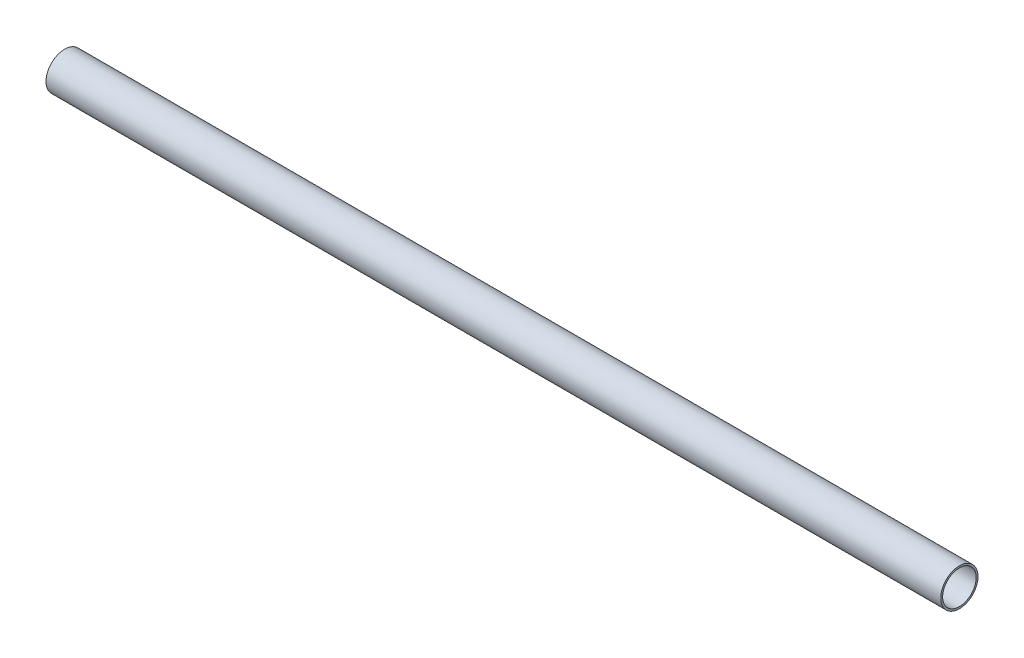
ISO-10303-21;
HEADER;
FILE_DESCRIPTION(('STEP AP214'),'2;1');
FILE_NAME('part.step','',(''),(''),'','','');
FILE_SCHEMA(('AUTOMOTIVE_DESIGN { 1 0 10303 214 1 1 1 1 }'));
ENDSEC;
DATA;
#1=APPLICATION_CONTEXT('core data for automotive mechanical design processes');
#2=APPLICATION_PROTOCOL_DEFINITION('international standard','automotive_design',2000,#1);
#3=PRODUCT_CONTEXT('',#1,'mechanical');
#4=PRODUCT('Part','Part','',(#3));
#5=PRODUCT_RELATED_PRODUCT_CATEGORY('part','',(#4));
#6=PRODUCT_DEFINITION_FORMATION('','',#4);
#7=PRODUCT_DEFINITION_CONTEXT('part definition',#1,'design');
#8=PRODUCT_DEFINITION('design','',#6,#7);
#9=PRODUCT_DEFINITION_SHAPE('','',#8);
#10=(LENGTH_UNIT() NAMED_UNIT(*) SI_UNIT(.MILLI.,.METRE.));
#11=(NAMED_UNIT(*) PLANE_ANGLE_UNIT() SI_UNIT($,.RADIAN.));
#12=(NAMED_UNIT(*) SI_UNIT($,.STERADIAN.) SOLID_ANGLE_UNIT());
#13=UNCERTAINTY_MEASURE_WITH_UNIT(LENGTH_MEASURE(1.E-05),#10,'distance_accuracy_value','');
#14=(GEOMETRIC_REPRESENTATION_CONTEXT(3) GLOBAL_UNCERTAINTY_ASSIGNED_CONTEXT((#13)) GLOBAL_UNIT_ASSIGNED_CONTEXT((#10,
#11,#12)) REPRESENTATION_CONTEXT('',''));
#15=CARTESIAN_POINT('',(0.,0.,0.));
#16=DIRECTION('',(0.,0.,1.));
#17=DIRECTION('',(1.,0.,0.));
#18=AXIS2_PLACEMENT_3D('',#15,#16,#17);
#19=CARTESIAN_POINT('',(609.6,0.,0.));
#20=DIRECTION('',(-1.,0.,0.));
#21=DIRECTION('',(0.,0.,1.));
#22=AXIS2_PLACEMENT_3D('',#19,#20,#21);
#23=CYLINDRICAL_SURFACE('',#22,12.7);
#24=CARTESIAN_POINT('',(609.6,0.,0.));
#25=DIRECTION('',(1.,0.,0.));
#26=DIRECTION('',(0.,0.,-1.));
#27=AXIS2_PLACEMENT_3D('',#24,#25,#26);
#28=CIRCLE('',#27,12.7);
#29=CARTESIAN_POINT('',(609.6,0.,12.7));
#30=VERTEX_POINT('',#29);
#31=EDGE_CURVE('E10',#30,#30,#28,.T.);
#32=CARTESIAN_POINT('',(0.,0.,0.));
#33=DIRECTION('',(1.,0.,0.));
#34=DIRECTION('',(0.,0.,-1.));
#35=AXIS2_PLACEMENT_3D('',#32,#33,#34);
#36=CIRCLE('',#35,12.7);
#37=CARTESIAN_POINT('',(0.,0.,12.7));
#38=VERTEX_POINT('',#37);
#39=EDGE_CURVE('E46',#38,#38,#36,.T.);
#40=CARTESIAN_POINT('',(609.6,0.,12.7));
#41=CARTESIAN_POINT('',(603.25,0.,12.7));
#42=CARTESIAN_POINT('',(596.9,0.,12.7));
#43=CARTESIAN_POINT('',(584.2,0.,12.7));
#44=CARTESIAN_POINT('',(577.85,0.,12.7));
#45=CARTESIAN_POINT('',(565.15,0.,12.7));
#46=CARTESIAN_POINT('',(558.8,0.,12.7));
#47=CARTESIAN_POINT('',(546.1,0.,12.7));
#48=CARTESIAN_POINT('',(539.75,0.,12.7));
#49=CARTESIAN_POINT('',(527.05,0.,12.7));
#50=CARTESIAN_POINT('',(520.7,0.,12.7));
#51=CARTESIAN_POINT('',(508.,0.,12.7));
#52=CARTESIAN_POINT('',(501.65,0.,12.7));
#53=CARTESIAN_POINT('',(488.95,0.,12.7));
#54=CARTESIAN_POINT('',(482.6,0.,12.7));
#55=CARTESIAN_POINT('',(469.9,0.,12.7));
#56=CARTESIAN_POINT('',(463.55,0.,12.7));
#57=CARTESIAN_POINT('',(450.85,0.,12.7));
#58=CARTESIAN_POINT('',(444.5,0.,12.7));
#59=CARTESIAN_POINT('',(431.8,0.,12.7));
#60=CARTESIAN_POINT('',(425.45,0.,12.7));
#61=CARTESIAN_POINT('',(412.75,0.,12.7));
#62=CARTESIAN_POINT('',(406.4,0.,12.7));
#63=CARTESIAN_POINT('',(393.7,0.,12.7));
#64=CARTESIAN_POINT('',(387.35,0.,12.7));
#65=CARTESIAN_POINT('',(374.65,0.,12.7));
#66=CARTESIAN_POINT('',(368.3,0.,12.7));
#67=CARTESIAN_POINT('',(355.6,0.,12.7));
#68=CARTESIAN_POINT('',(349.25,0.,12.7));
#69=CARTESIAN_POINT('',(336.55,0.,12.7));
#70=CARTESIAN_POINT('',(330.2,0.,12.7));
#71=CARTESIAN_POINT('',(317.5,0.,12.7));
#72=CARTESIAN_POINT('',(311.15,0.,12.7));
#73=CARTESIAN_POINT('',(298.45,0.,12.7));
#74=CARTESIAN_POINT('',(292.1,0.,12.7));
#75=CARTESIAN_POINT('',(279.4,0.,12.7));
#76=CARTESIAN_POINT('',(273.05,0.,12.7));
#77=CARTESIAN_POINT('',(260.35,0.,12.7));
#78=CARTESIAN_POINT('',(254.,0.,12.7));
#79=CARTESIAN_POINT('',(241.3,0.,12.7));
#80=CARTESIAN_POINT('',(234.95,0.,12.7));
#81=CARTESIAN_POINT('',(222.25,0.,12.7));
#82=CARTESIAN_POINT('',(215.9,0.,12.7));
#83=CARTESIAN_POINT('',(203.2,0.,12.7));
#84=CARTESIAN_POINT('',(196.85,0.,12.7));
#85=CARTESIAN_POINT('',(184.15,0.,12.7));
#86=CARTESIAN_POINT('',(177.8,0.,12.7));
#87=CARTESIAN_POINT('',(165.1,0.,12.7));
#88=CARTESIAN_POINT('',(158.75,0.,12.7));
#89=CARTESIAN_POINT('',(146.05,0.,12.7));
#90=CARTESIAN_POINT('',(139.7,0.,12.7));
#91=CARTESIAN_POINT('',(127.,0.,12.7));
#92=CARTESIAN_POINT('',(120.65,0.,12.7));
#93=CARTESIAN_POINT('',(107.95,0.,12.7));
#94=CARTESIAN_POINT('',(101.6,0.,12.7));
#95=CARTESIAN_POINT('',(88.9,0.,12.7));
#96=CARTESIAN_POINT('',(82.5500000000001,0.,12.7));
#97=CARTESIAN_POINT('',(69.85,0.,12.7));
#98=CARTESIAN_POINT('',(63.5,0.,12.7));
#99=CARTESIAN_POINT('',(50.8,0.,12.7));
#100=CARTESIAN_POINT('',(44.45,0.,12.7));
#101=CARTESIAN_POINT('',(31.75,0.,12.7));
#102=CARTESIAN_POINT('',(25.4,0.,12.7));
#103=CARTESIAN_POINT('',(12.7,0.,12.7));
#104=CARTESIAN_POINT('',(6.35000000000001,0.,12.7));
#105=CARTESIAN_POINT('',(0.,0.,12.7));
#106=B_SPLINE_CURVE_WITH_KNOTS('',3,(#40,#41,#42,#43,#44,#45,#46,#47,#48,#49,#50,#51,#52,#53,
#54,#55,#56,#57,#58,#59,#60,#61,#62,#63,#64,#65,#66,#67,#68,#69,#70,#71,#72,#73,#74,#75,#76,#77,
#78,#79,#80,#81,#82,#83,#84,#85,#86,#87,#88,#89,#90,#91,#92,#93,#94,#95,#96,#97,#98,#99,#100,
#101,#102,#103,#104,#105),.UNSPECIFIED.,.F.,.F.,(4,2,2,2,2,2,2,2,2,2,2,2,2,2,2,2,2,2,2,2,2,2,2,
2,2,2,2,2,2,2,2,2,4),(0.,19.05,38.1,57.15,76.2,95.2500000000001,114.3,133.35,152.4,171.45,190.5,
209.55,228.6,247.65,266.7,285.75,304.8,323.85,342.9,361.95,381.,400.05,419.1,438.15,457.2,
476.25,495.3,514.35,533.4,552.45,571.5,590.55,609.6),.UNSPECIFIED.);
#107=EDGE_CURVE('BSEAM43',#30,#38,#106,.T.);
#108=ORIENTED_EDGE('',*,*,#31,.F.);
#109=ORIENTED_EDGE('',*,*,#39,.T.);
#110=ORIENTED_EDGE('',*,*,#107,.T.);
#111=ORIENTED_EDGE('',*,*,#107,.F.);
#112=EDGE_LOOP('',(#108,#110,#109,#111));
#113=FACE_BOUND('',#112,.T.);
#114=ADVANCED_FACE('F43',(#113),#23,.T.);
#115=CARTESIAN_POINT('',(609.6,0.,0.));
#116=DIRECTION('',(1.,0.,0.));
#117=DIRECTION('',(0.,0.,-1.));
#118=AXIS2_PLACEMENT_3D('',#115,#116,#117);
#119=PLANE('',#118);
#120=CARTESIAN_POINT('',(609.6,0.,0.));
#121=DIRECTION('',(1.,0.,0.));
#122=DIRECTION('',(0.,0.,-1.));
#123=AXIS2_PLACEMENT_3D('',#120,#121,#122);
#124=CIRCLE('',#123,11.43);
#125=CARTESIAN_POINT('',(609.6,0.,-11.43));
#126=VERTEX_POINT('',#125);
#127=EDGE_CURVE('E55',#126,#126,#124,.T.);
#128=ORIENTED_EDGE('',*,*,#127,.F.);
#129=EDGE_LOOP('',(#128));
#130=FACE_BOUND('',#129,.T.);
#131=ORIENTED_EDGE('',*,*,#31,.T.);
#132=EDGE_LOOP('',(#131));
#133=FACE_BOUND('',#132,.T.);
#134=ADVANCED_FACE('F75',(#130,#133),#119,.T.);
#135=CARTESIAN_POINT('',(0.,0.,0.));
#136=DIRECTION('',(1.,0.,0.));
#137=DIRECTION('',(0.,0.,-1.));
#138=AXIS2_PLACEMENT_3D('',#135,#136,#137);
#139=PLANE('',#138);
#140=CARTESIAN_POINT('',(0.,0.,0.));
#141=DIRECTION('',(1.,0.,0.));
#142=DIRECTION('',(0.,0.,-1.));
#143=AXIS2_PLACEMENT_3D('',#140,#141,#142);
#144=CIRCLE('',#143,11.43);
#145=CARTESIAN_POINT('',(0.,0.,-11.43));
#146=VERTEX_POINT('',#145);
#147=EDGE_CURVE('E60',#146,#146,#144,.T.);
#148=ORIENTED_EDGE('',*,*,#147,.T.);
#149=EDGE_LOOP('',(#148));
#150=FACE_BOUND('',#149,.T.);
#151=ORIENTED_EDGE('',*,*,#39,.F.);
#152=EDGE_LOOP('',(#151));
#153=FACE_BOUND('',#152,.T.);
#154=ADVANCED_FACE('F65',(#150,#153),#139,.F.);
#155=CARTESIAN_POINT('',(0.,0.,0.));
#156=DIRECTION('',(1.,0.,0.));
#157=DIRECTION('',(0.,0.,-1.));
#158=AXIS2_PLACEMENT_3D('',#155,#156,#157);
#159=CYLINDRICAL_SURFACE('',#158,11.43);
#160=CARTESIAN_POINT('',(609.6,0.,-11.43));
#161=CARTESIAN_POINT('',(603.25,0.,-11.43));
#162=CARTESIAN_POINT('',(596.9,0.,-11.43));
#163=CARTESIAN_POINT('',(584.2,0.,-11.43));
#164=CARTESIAN_POINT('',(577.85,0.,-11.43));
#165=CARTESIAN_POINT('',(565.15,0.,-11.43));
#166=CARTESIAN_POINT('',(558.8,0.,-11.43));
#167=CARTESIAN_POINT('',(546.1,0.,-11.43));
#168=CARTESIAN_POINT('',(539.75,0.,-11.43));
#169=CARTESIAN_POINT('',(527.05,0.,-11.43));
#170=CARTESIAN_POINT('',(520.7,0.,-11.43));
#171=CARTESIAN_POINT('',(508.,0.,-11.43));
#172=CARTESIAN_POINT('',(501.65,0.,-11.43));
#173=CARTESIAN_POINT('',(488.95,0.,-11.43));
#174=CARTESIAN_POINT('',(482.6,0.,-11.43));
#175=CARTESIAN_POINT('',(469.9,0.,-11.43));
#176=CARTESIAN_POINT('',(463.55,0.,-11.43));
#177=CARTESIAN_POINT('',(450.85,0.,-11.43));
#178=CARTESIAN_POINT('',(444.5,0.,-11.43));
#179=CARTESIAN_POINT('',(431.8,0.,-11.43));
#180=CARTESIAN_POINT('',(425.45,0.,-11.43));
#181=CARTESIAN_POINT('',(412.75,0.,-11.43));
#182=CARTESIAN_POINT('',(406.4,0.,-11.43));
#183=CARTESIAN_POINT('',(393.7,0.,-11.43));
#184=CARTESIAN_POINT('',(387.35,0.,-11.43));
#185=CARTESIAN_POINT('',(374.65,0.,-11.43));
#186=CARTESIAN_POINT('',(368.3,0.,-11.43));
#187=CARTESIAN_POINT('',(355.6,0.,-11.43));
#188=CARTESIAN_POINT('',(349.25,0.,-11.43));
#189=CARTESIAN_POINT('',(336.55,0.,-11.43));
#190=CARTESIAN_POINT('',(330.2,0.,-11.43));
#191=CARTESIAN_POINT('',(317.5,0.,-11.43));
#192=CARTESIAN_POINT('',(311.15,0.,-11.43));
#193=CARTESIAN_POINT('',(298.45,0.,-11.43));
#194=CARTESIAN_POINT('',(292.1,0.,-11.43));
#195=CARTESIAN_POINT('',(279.4,0.,-11.43));
#196=CARTESIAN_POINT('',(273.05,0.,-11.43));
#197=CARTESIAN_POINT('',(260.35,0.,-11.43));
#198=CARTESIAN_POINT('',(254.,0.,-11.43));
#199=CARTESIAN_POINT('',(241.3,0.,-11.43));
#200=CARTESIAN_POINT('',(234.95,0.,-11.43));
#201=CARTESIAN_POINT('',(222.25,0.,-11.43));
#202=CARTESIAN_POINT('',(215.9,0.,-11.43));
#203=CARTESIAN_POINT('',(203.2,0.,-11.43));
#204=CARTESIAN_POINT('',(196.85,0.,-11.43));
#205=CARTESIAN_POINT('',(184.15,0.,-11.43));
#206=CARTESIAN_POINT('',(177.8,0.,-11.43));
#207=CARTESIAN_POINT('',(165.1,0.,-11.43));
#208=CARTESIAN_POINT('',(158.75,0.,-11.43));
#209=CARTESIAN_POINT('',(146.05,0.,-11.43));
#210=CARTESIAN_POINT('',(139.7,0.,-11.43));
#211=CARTESIAN_POINT('',(127.,0.,-11.43));
#212=CARTESIAN_POINT('',(120.65,0.,-11.43));
#213=CARTESIAN_POINT('',(107.95,0.,-11.43));
#214=CARTESIAN_POINT('',(101.6,0.,-11.43));
#215=CARTESIAN_POINT('',(88.9,0.,-11.43));
#216=CARTESIAN_POINT('',(82.55,0.,-11.43));
#217=CARTESIAN_POINT('',(69.85,0.,-11.43));
#218=CARTESIAN_POINT('',(63.5,0.,-11.43));
#219=CARTESIAN_POINT('',(50.8,0.,-11.43));
#220=CARTESIAN_POINT('',(44.45,0.,-11.43));
#221=CARTESIAN_POINT('',(31.75,0.,-11.43));
#222=CARTESIAN_POINT('',(25.4,0.,-11.43));
#223=CARTESIAN_POINT('',(12.7,0.,-11.43));
#224=CARTESIAN_POINT('',(6.35000000000001,0.,-11.43));
#225=CARTESIAN_POINT('',(0.,0.,-11.43));
#226=B_SPLINE_CURVE_WITH_KNOTS('',3,(#160,#161,#162,#163,#164,#165,#166,#167,#168,#169,#170,
#171,#172,#173,#174,#175,#176,#177,#178,#179,#180,#181,#182,#183,#184,#185,#186,#187,#188,#189,
#190,#191,#192,#193,#194,#195,#196,#197,#198,#199,#200,#201,#202,#203,#204,#205,#206,#207,#208,
#209,#210,#211,#212,#213,#214,#215,#216,#217,#218,#219,#220,#221,#222,#223,#224,#225),
.UNSPECIFIED.,.F.,.F.,(4,2,2,2,2,2,2,2,2,2,2,2,2,2,2,2,2,2,2,2,2,2,2,2,2,2,2,2,2,2,2,2,4),(0.,
19.05,38.1,57.15,76.2,95.2500000000001,114.3,133.35,152.4,171.45,190.5,209.55,228.6,247.65,
266.7,285.75,304.8,323.85,342.9,361.95,381.,400.05,419.1,438.15,457.2,476.25,495.3,514.35,533.4,
552.45,571.5,590.55,609.6),.UNSPECIFIED.);
#227=EDGE_CURVE('BSEAM68',#126,#146,#226,.T.);
#228=ORIENTED_EDGE('',*,*,#127,.T.);
#229=ORIENTED_EDGE('',*,*,#147,.F.);
#230=ORIENTED_EDGE('',*,*,#227,.T.);
#231=ORIENTED_EDGE('',*,*,#227,.F.);
#232=EDGE_LOOP('',(#228,#230,#229,#231));
#233=FACE_BOUND('',#232,.T.);
#234=ADVANCED_FACE('F68',(#233),#159,.F.);
#235=CLOSED_SHELL('',(#114,#134,#154,#234));
#236=MANIFOLD_SOLID_BREP('B2',#235);
#237=ADVANCED_BREP_SHAPE_REPRESENTATION('',(#18,#236),#14);
#238=SHAPE_DEFINITION_REPRESENTATION(#9,#237);
ENDSEC;
END-ISO-10303-21;
